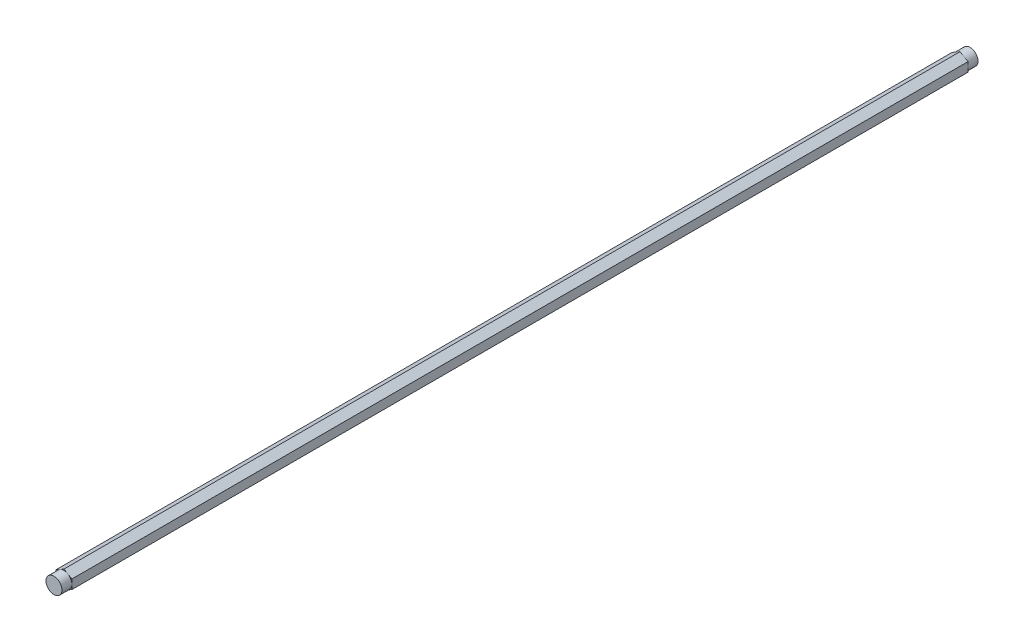
ISO-10303-21;
HEADER;
FILE_DESCRIPTION(('STEP AP214'),'2;1');
FILE_NAME('part.step','',(''),(''),'','','');
FILE_SCHEMA(('AUTOMOTIVE_DESIGN { 1 0 10303 214 1 1 1 1 }'));
ENDSEC;
DATA;
#1=APPLICATION_CONTEXT('core data for automotive mechanical design processes');
#2=APPLICATION_PROTOCOL_DEFINITION('international standard','automotive_design',2000,#1);
#3=PRODUCT_CONTEXT('',#1,'mechanical');
#4=PRODUCT('Part','Part','',(#3));
#5=PRODUCT_RELATED_PRODUCT_CATEGORY('part','',(#4));
#6=PRODUCT_DEFINITION_FORMATION('','',#4);
#7=PRODUCT_DEFINITION_CONTEXT('part definition',#1,'design');
#8=PRODUCT_DEFINITION('design','',#6,#7);
#9=PRODUCT_DEFINITION_SHAPE('','',#8);
#10=(LENGTH_UNIT() NAMED_UNIT(*) SI_UNIT(.MILLI.,.METRE.));
#11=(NAMED_UNIT(*) PLANE_ANGLE_UNIT() SI_UNIT($,.RADIAN.));
#12=(NAMED_UNIT(*) SI_UNIT($,.STERADIAN.) SOLID_ANGLE_UNIT());
#13=UNCERTAINTY_MEASURE_WITH_UNIT(LENGTH_MEASURE(1.E-05),#10,'distance_accuracy_value','');
#14=(GEOMETRIC_REPRESENTATION_CONTEXT(3) GLOBAL_UNCERTAINTY_ASSIGNED_CONTEXT((#13)) GLOBAL_UNIT_ASSIGNED_CONTEXT((#10,
#11,#12)) REPRESENTATION_CONTEXT('',''));
#15=CARTESIAN_POINT('',(0.,0.,0.));
#16=DIRECTION('',(0.,0.,1.));
#17=DIRECTION('',(1.,0.,0.));
#18=AXIS2_PLACEMENT_3D('',#15,#16,#17);
#19=CARTESIAN_POINT('',(6.35,-3.66617420935412,365.0361));
#20=DIRECTION('',(-1.,0.,0.));
#21=DIRECTION('',(0.,-1.,0.));
#22=AXIS2_PLACEMENT_3D('',#19,#20,#21);
#23=PLANE('',#22);
#24=DIRECTION('',(0.,-1.,0.));
#25=VECTOR('',#24,1.);
#26=CARTESIAN_POINT('',(6.35,-3.66617420935412,-357.0859));
#27=LINE('',#26,#25);
#28=CARTESIAN_POINT('',(6.35,3.66617420935413,-357.0859));
#29=VERTEX_POINT('',#28);
#30=CARTESIAN_POINT('',(6.35,0.,-357.0859));
#31=VERTEX_POINT('',#30);
#32=EDGE_CURVE('E138',#29,#31,#27,.T.);
#33=ORIENTED_EDGE('',*,*,#32,.F.);
#34=DIRECTION('',(0.,0.,-1.));
#35=VECTOR('',#34,1.);
#36=CARTESIAN_POINT('',(6.35,3.66617420935412,365.0361));
#37=LINE('',#36,#35);
#38=CARTESIAN_POINT('',(6.35,3.66617420935412,357.0859));
#39=VERTEX_POINT('',#38);
#40=EDGE_CURVE('E232',#39,#29,#37,.T.);
#41=ORIENTED_EDGE('',*,*,#40,.F.);
#42=DIRECTION('',(0.,1.,0.));
#43=VECTOR('',#42,1.);
#44=CARTESIAN_POINT('',(6.35,-3.66617420935412,357.0859));
#45=LINE('',#44,#43);
#46=CARTESIAN_POINT('',(6.35,0.,357.0859));
#47=VERTEX_POINT('',#46);
#48=EDGE_CURVE('E210',#47,#39,#45,.T.);
#49=ORIENTED_EDGE('',*,*,#48,.F.);
#50=CARTESIAN_POINT('',(6.35,-3.66617420935412,357.0859));
#51=VERTEX_POINT('',#50);
#52=EDGE_CURVE('E213',#51,#47,#45,.T.);
#53=ORIENTED_EDGE('',*,*,#52,.F.);
#54=DIRECTION('',(0.,0.,-1.));
#55=VECTOR('',#54,1.);
#56=CARTESIAN_POINT('',(6.35,-3.66617420935412,365.0361));
#57=LINE('',#56,#55);
#58=CARTESIAN_POINT('',(6.35,-3.66617420935412,-357.0859));
#59=VERTEX_POINT('',#58);
#60=EDGE_CURVE('E172',#51,#59,#57,.T.);
#61=ORIENTED_EDGE('',*,*,#60,.T.);
#62=EDGE_CURVE('E151',#31,#59,#27,.T.);
#63=ORIENTED_EDGE('',*,*,#62,.F.);
#64=EDGE_LOOP('',(#33,#41,#49,#53,#61,#63));
#65=FACE_BOUND('',#64,.T.);
#66=ADVANCED_FACE('F47',(#65),#23,.F.);
#67=CARTESIAN_POINT('',(6.35,3.66617420935412,365.0361));
#68=DIRECTION('',(-0.5,-0.866025403784439,0.));
#69=DIRECTION('',(0.866025403784439,-0.5,0.));
#70=AXIS2_PLACEMENT_3D('',#67,#68,#69);
#71=PLANE('',#70);
#72=DIRECTION('',(0.866025403784439,-0.5,0.));
#73=VECTOR('',#72,1.);
#74=CARTESIAN_POINT('',(6.35,3.66617420935412,-357.0859));
#75=LINE('',#74,#73);
#76=CARTESIAN_POINT('',(0.,7.33234841870825,-357.0859));
#77=VERTEX_POINT('',#76);
#78=CARTESIAN_POINT('',(3.175,5.49926131403119,-357.0859));
#79=VERTEX_POINT('',#78);
#80=EDGE_CURVE('E183',#77,#79,#75,.T.);
#81=ORIENTED_EDGE('',*,*,#80,.F.);
#82=DIRECTION('',(0.,0.,-1.));
#83=VECTOR('',#82,1.);
#84=CARTESIAN_POINT('',(0.,7.33234841870825,365.0361));
#85=LINE('',#84,#83);
#86=CARTESIAN_POINT('',(0.,7.33234841870825,357.0859));
#87=VERTEX_POINT('',#86);
#88=EDGE_CURVE('E228',#87,#77,#85,.T.);
#89=ORIENTED_EDGE('',*,*,#88,.F.);
#90=DIRECTION('',(-0.866025403784439,0.5,0.));
#91=VECTOR('',#90,1.);
#92=CARTESIAN_POINT('',(6.35,3.66617420935412,357.0859));
#93=LINE('',#92,#91);
#94=CARTESIAN_POINT('',(3.175,5.49926131403119,357.0859));
#95=VERTEX_POINT('',#94);
#96=EDGE_CURVE('E206',#95,#87,#93,.T.);
#97=ORIENTED_EDGE('',*,*,#96,.F.);
#98=EDGE_CURVE('E209',#39,#95,#93,.T.);
#99=ORIENTED_EDGE('',*,*,#98,.F.);
#100=ORIENTED_EDGE('',*,*,#40,.T.);
#101=EDGE_CURVE('E144',#79,#29,#75,.T.);
#102=ORIENTED_EDGE('',*,*,#101,.F.);
#103=EDGE_LOOP('',(#81,#89,#97,#99,#100,#102));
#104=FACE_BOUND('',#103,.T.);
#105=ADVANCED_FACE('F321',(#104),#71,.F.);
#106=CARTESIAN_POINT('',(0.,7.33234841870825,365.0361));
#107=DIRECTION('',(0.5,-0.866025403784439,0.));
#108=DIRECTION('',(0.866025403784439,0.5,0.));
#109=AXIS2_PLACEMENT_3D('',#106,#107,#108);
#110=PLANE('',#109);
#111=DIRECTION('',(0.866025403784439,0.5,0.));
#112=VECTOR('',#111,1.);
#113=CARTESIAN_POINT('',(0.,7.33234841870825,-357.0859));
#114=LINE('',#113,#112);
#115=CARTESIAN_POINT('',(-6.35,3.66617420935412,-357.0859));
#116=VERTEX_POINT('',#115);
#117=CARTESIAN_POINT('',(-3.175,5.49926131403119,-357.0859));
#118=VERTEX_POINT('',#117);
#119=EDGE_CURVE('E187',#116,#118,#114,.T.);
#120=ORIENTED_EDGE('',*,*,#119,.F.);
#121=DIRECTION('',(0.,0.,-1.));
#122=VECTOR('',#121,1.);
#123=CARTESIAN_POINT('',(-6.35,3.66617420935412,365.0361));
#124=LINE('',#123,#122);
#125=CARTESIAN_POINT('',(-6.35,3.66617420935412,357.0859));
#126=VERTEX_POINT('',#125);
#127=EDGE_CURVE('E224',#126,#116,#124,.T.);
#128=ORIENTED_EDGE('',*,*,#127,.F.);
#129=DIRECTION('',(-0.866025403784439,-0.5,0.));
#130=VECTOR('',#129,1.);
#131=CARTESIAN_POINT('',(0.,7.33234841870825,357.0859));
#132=LINE('',#131,#130);
#133=CARTESIAN_POINT('',(-3.175,5.49926131403119,357.0859));
#134=VERTEX_POINT('',#133);
#135=EDGE_CURVE('E202',#134,#126,#132,.T.);
#136=ORIENTED_EDGE('',*,*,#135,.F.);
#137=EDGE_CURVE('E205',#87,#134,#132,.T.);
#138=ORIENTED_EDGE('',*,*,#137,.F.);
#139=ORIENTED_EDGE('',*,*,#88,.T.);
#140=EDGE_CURVE('E184',#118,#77,#114,.T.);
#141=ORIENTED_EDGE('',*,*,#140,.F.);
#142=EDGE_LOOP('',(#120,#128,#136,#138,#139,#141));
#143=FACE_BOUND('',#142,.T.);
#144=ADVANCED_FACE('F305',(#143),#110,.F.);
#145=CARTESIAN_POINT('',(-6.35,3.66617420935412,365.0361));
#146=DIRECTION('',(1.,0.,0.));
#147=DIRECTION('',(0.,1.,0.));
#148=AXIS2_PLACEMENT_3D('',#145,#146,#147);
#149=PLANE('',#148);
#150=DIRECTION('',(0.,1.,0.));
#151=VECTOR('',#150,1.);
#152=CARTESIAN_POINT('',(-6.35,3.66617420935412,-357.0859));
#153=LINE('',#152,#151);
#154=CARTESIAN_POINT('',(-6.35,-3.66617420935412,-357.0859));
#155=VERTEX_POINT('',#154);
#156=CARTESIAN_POINT('',(-6.35,0.,-357.0859));
#157=VERTEX_POINT('',#156);
#158=EDGE_CURVE('E177',#155,#157,#153,.T.);
#159=ORIENTED_EDGE('',*,*,#158,.F.);
#160=DIRECTION('',(0.,0.,-1.));
#161=VECTOR('',#160,1.);
#162=CARTESIAN_POINT('',(-6.35,-3.66617420935412,365.0361));
#163=LINE('',#162,#161);
#164=CARTESIAN_POINT('',(-6.35,-3.66617420935412,357.0859));
#165=VERTEX_POINT('',#164);
#166=EDGE_CURVE('E220',#165,#155,#163,.T.);
#167=ORIENTED_EDGE('',*,*,#166,.F.);
#168=DIRECTION('',(0.,-1.,0.));
#169=VECTOR('',#168,1.);
#170=CARTESIAN_POINT('',(-6.35,3.66617420935412,357.0859));
#171=LINE('',#170,#169);
#172=CARTESIAN_POINT('',(-6.35,0.,357.0859));
#173=VERTEX_POINT('',#172);
#174=EDGE_CURVE('E198',#173,#165,#171,.T.);
#175=ORIENTED_EDGE('',*,*,#174,.F.);
#176=EDGE_CURVE('E201',#126,#173,#171,.T.);
#177=ORIENTED_EDGE('',*,*,#176,.F.);
#178=ORIENTED_EDGE('',*,*,#127,.T.);
#179=EDGE_CURVE('E180',#157,#116,#153,.T.);
#180=ORIENTED_EDGE('',*,*,#179,.F.);
#181=EDGE_LOOP('',(#159,#167,#175,#177,#178,#180));
#182=FACE_BOUND('',#181,.T.);
#183=ADVANCED_FACE('F291',(#182),#149,.F.);
#184=CARTESIAN_POINT('',(-6.35,-3.66617420935412,365.0361));
#185=DIRECTION('',(0.5,0.866025403784439,0.));
#186=DIRECTION('',(-0.866025403784439,0.5,0.));
#187=AXIS2_PLACEMENT_3D('',#184,#185,#186);
#188=PLANE('',#187);
#189=DIRECTION('',(-0.866025403784439,0.5,0.));
#190=VECTOR('',#189,1.);
#191=CARTESIAN_POINT('',(-6.35,-3.66617420935412,-357.0859));
#192=LINE('',#191,#190);
#193=CARTESIAN_POINT('',(0.,-7.33234841870825,-357.0859));
#194=VERTEX_POINT('',#193);
#195=CARTESIAN_POINT('',(-3.175,-5.49926131403119,-357.0859));
#196=VERTEX_POINT('',#195);
#197=EDGE_CURVE('E168',#194,#196,#192,.T.);
#198=ORIENTED_EDGE('',*,*,#197,.F.);
#199=DIRECTION('',(0.,0.,-1.));
#200=VECTOR('',#199,1.);
#201=CARTESIAN_POINT('',(0.,-7.33234841870825,365.0361));
#202=LINE('',#201,#200);
#203=CARTESIAN_POINT('',(0.,-7.33234841870825,357.0859));
#204=VERTEX_POINT('',#203);
#205=EDGE_CURVE('E216',#204,#194,#202,.T.);
#206=ORIENTED_EDGE('',*,*,#205,.F.);
#207=DIRECTION('',(0.866025403784439,-0.5,0.));
#208=VECTOR('',#207,1.);
#209=CARTESIAN_POINT('',(-6.35,-3.66617420935412,357.0859));
#210=LINE('',#209,#208);
#211=CARTESIAN_POINT('',(-3.175,-5.49926131403119,357.0859));
#212=VERTEX_POINT('',#211);
#213=EDGE_CURVE('E192',#212,#204,#210,.T.);
#214=ORIENTED_EDGE('',*,*,#213,.F.);
#215=EDGE_CURVE('E197',#165,#212,#210,.T.);
#216=ORIENTED_EDGE('',*,*,#215,.F.);
#217=ORIENTED_EDGE('',*,*,#166,.T.);
#218=EDGE_CURVE('E150',#196,#155,#192,.T.);
#219=ORIENTED_EDGE('',*,*,#218,.F.);
#220=EDGE_LOOP('',(#198,#206,#214,#216,#217,#219));
#221=FACE_BOUND('',#220,.T.);
#222=ADVANCED_FACE('F294',(#221),#188,.F.);
#223=CARTESIAN_POINT('',(0.,-7.33234841870825,365.0361));
#224=DIRECTION('',(-0.5,0.866025403784439,0.));
#225=DIRECTION('',(-0.866025403784439,-0.5,0.));
#226=AXIS2_PLACEMENT_3D('',#223,#224,#225);
#227=PLANE('',#226);
#228=DIRECTION('',(-0.866025403784439,-0.5,0.));
#229=VECTOR('',#228,1.);
#230=CARTESIAN_POINT('',(0.,-7.33234841870825,-357.0859));
#231=LINE('',#230,#229);
#232=CARTESIAN_POINT('',(3.175,-5.49926131403119,-357.0859));
#233=VERTEX_POINT('',#232);
#234=EDGE_CURVE('E12',#59,#233,#231,.T.);
#235=ORIENTED_EDGE('',*,*,#234,.F.);
#236=ORIENTED_EDGE('',*,*,#60,.F.);
#237=DIRECTION('',(0.866025403784439,0.5,0.));
#238=VECTOR('',#237,1.);
#239=CARTESIAN_POINT('',(0.,-7.33234841870825,357.0859));
#240=LINE('',#239,#238);
#241=CARTESIAN_POINT('',(3.175,-5.49926131403119,357.0859));
#242=VERTEX_POINT('',#241);
#243=EDGE_CURVE('E239',#242,#51,#240,.T.);
#244=ORIENTED_EDGE('',*,*,#243,.F.);
#245=EDGE_CURVE('E241',#204,#242,#240,.T.);
#246=ORIENTED_EDGE('',*,*,#245,.F.);
#247=ORIENTED_EDGE('',*,*,#205,.T.);
#248=EDGE_CURVE('E50',#233,#194,#231,.T.);
#249=ORIENTED_EDGE('',*,*,#248,.F.);
#250=EDGE_LOOP('',(#235,#236,#244,#246,#247,#249));
#251=FACE_BOUND('',#250,.T.);
#252=ADVANCED_FACE('F257',(#251),#227,.F.);
#253=CARTESIAN_POINT('',(0.,0.,357.0859));
#254=DIRECTION('',(0.,0.,1.));
#255=DIRECTION('',(1.,0.,0.));
#256=AXIS2_PLACEMENT_3D('',#253,#254,#255);
#257=PLANE('',#256);
#258=ORIENTED_EDGE('',*,*,#52,.T.);
#259=CARTESIAN_POINT('',(0.,0.,357.0859));
#260=DIRECTION('',(0.,0.,1.));
#261=DIRECTION('',(1.,0.,0.));
#262=AXIS2_PLACEMENT_3D('',#259,#260,#261);
#263=CIRCLE('',#262,6.35);
#264=EDGE_CURVE('E194',#242,#47,#263,.T.);
#265=ORIENTED_EDGE('',*,*,#264,.F.);
#266=ORIENTED_EDGE('',*,*,#243,.T.);
#267=EDGE_LOOP('',(#258,#265,#266));
#268=FACE_BOUND('',#267,.T.);
#269=ADVANCED_FACE('F259',(#268),#257,.T.);
#270=ORIENTED_EDGE('',*,*,#48,.T.);
#271=ORIENTED_EDGE('',*,*,#98,.T.);
#272=EDGE_CURVE('E188',#47,#95,#263,.T.);
#273=ORIENTED_EDGE('',*,*,#272,.F.);
#274=EDGE_LOOP('',(#270,#271,#273));
#275=FACE_BOUND('',#274,.T.);
#276=ADVANCED_FACE('F331',(#275),#257,.T.);
#277=ORIENTED_EDGE('',*,*,#96,.T.);
#278=ORIENTED_EDGE('',*,*,#137,.T.);
#279=EDGE_CURVE('E193',#95,#134,#263,.T.);
#280=ORIENTED_EDGE('',*,*,#279,.F.);
#281=EDGE_LOOP('',(#277,#278,#280));
#282=FACE_BOUND('',#281,.T.);
#283=ADVANCED_FACE('F325',(#282),#257,.T.);
#284=ORIENTED_EDGE('',*,*,#135,.T.);
#285=ORIENTED_EDGE('',*,*,#176,.T.);
#286=EDGE_CURVE('E269',#134,#173,#263,.T.);
#287=ORIENTED_EDGE('',*,*,#286,.F.);
#288=EDGE_LOOP('',(#284,#285,#287));
#289=FACE_BOUND('',#288,.T.);
#290=ADVANCED_FACE('F326',(#289),#257,.T.);
#291=ORIENTED_EDGE('',*,*,#174,.T.);
#292=ORIENTED_EDGE('',*,*,#215,.T.);
#293=EDGE_CURVE('E272',#173,#212,#263,.T.);
#294=ORIENTED_EDGE('',*,*,#293,.F.);
#295=EDGE_LOOP('',(#291,#292,#294));
#296=FACE_BOUND('',#295,.T.);
#297=ADVANCED_FACE('F297',(#296),#257,.T.);
#298=ORIENTED_EDGE('',*,*,#213,.T.);
#299=ORIENTED_EDGE('',*,*,#245,.T.);
#300=EDGE_CURVE('E70',#212,#242,#263,.T.);
#301=ORIENTED_EDGE('',*,*,#300,.F.);
#302=EDGE_LOOP('',(#298,#299,#301));
#303=FACE_BOUND('',#302,.T.);
#304=ADVANCED_FACE('F253',(#303),#257,.T.);
#305=CARTESIAN_POINT('',(0.,0.,357.0859));
#306=DIRECTION('',(0.,0.,1.));
#307=DIRECTION('',(1.,0.,0.));
#308=AXIS2_PLACEMENT_3D('',#305,#306,#307);
#309=CYLINDRICAL_SURFACE('',#308,6.35);
#310=CARTESIAN_POINT('',(0.,0.,365.0361));
#311=DIRECTION('',(0.,0.,1.));
#312=DIRECTION('',(1.,0.,0.));
#313=AXIS2_PLACEMENT_3D('',#310,#311,#312);
#314=CIRCLE('',#313,6.35);
#315=CARTESIAN_POINT('',(6.35,0.,365.0361));
#316=VERTEX_POINT('',#315);
#317=EDGE_CURVE('E235',#316,#316,#314,.T.);
#318=ORIENTED_EDGE('',*,*,#317,.F.);
#319=EDGE_LOOP('',(#318));
#320=FACE_BOUND('',#319,.T.);
#321=ORIENTED_EDGE('',*,*,#264,.T.);
#322=ORIENTED_EDGE('',*,*,#272,.T.);
#323=ORIENTED_EDGE('',*,*,#279,.T.);
#324=ORIENTED_EDGE('',*,*,#286,.T.);
#325=ORIENTED_EDGE('',*,*,#293,.T.);
#326=ORIENTED_EDGE('',*,*,#300,.T.);
#327=EDGE_LOOP('',(#321,#322,#323,#324,#325,#326));
#328=FACE_BOUND('',#327,.T.);
#329=ADVANCED_FACE('F327',(#320,#328),#309,.T.);
#330=CARTESIAN_POINT('',(0.,0.,365.0361));
#331=DIRECTION('',(0.,0.,1.));
#332=DIRECTION('',(1.,0.,0.));
#333=AXIS2_PLACEMENT_3D('',#330,#331,#332);
#334=PLANE('',#333);
#335=ORIENTED_EDGE('',*,*,#317,.T.);
#336=EDGE_LOOP('',(#335));
#337=FACE_BOUND('',#336,.T.);
#338=ADVANCED_FACE('F358',(#337),#334,.T.);
#339=CARTESIAN_POINT('',(0.,0.,-357.0859));
#340=DIRECTION('',(0.,0.,-1.));
#341=DIRECTION('',(-1.,0.,0.));
#342=AXIS2_PLACEMENT_3D('',#339,#340,#341);
#343=PLANE('',#342);
#344=ORIENTED_EDGE('',*,*,#119,.T.);
#345=CARTESIAN_POINT('',(0.,0.,-357.0859));
#346=DIRECTION('',(0.,0.,1.));
#347=DIRECTION('',(1.,0.,0.));
#348=AXIS2_PLACEMENT_3D('',#345,#346,#347);
#349=CIRCLE('',#348,6.35);
#350=EDGE_CURVE('E311',#118,#157,#349,.T.);
#351=ORIENTED_EDGE('',*,*,#350,.T.);
#352=ORIENTED_EDGE('',*,*,#179,.T.);
#353=EDGE_LOOP('',(#344,#351,#352));
#354=FACE_BOUND('',#353,.T.);
#355=ADVANCED_FACE('F310',(#354),#343,.T.);
#356=ORIENTED_EDGE('',*,*,#140,.T.);
#357=ORIENTED_EDGE('',*,*,#80,.T.);
#358=EDGE_CURVE('E166',#79,#118,#349,.T.);
#359=ORIENTED_EDGE('',*,*,#358,.T.);
#360=EDGE_LOOP('',(#356,#357,#359));
#361=FACE_BOUND('',#360,.T.);
#362=ADVANCED_FACE('F314',(#361),#343,.T.);
#363=ORIENTED_EDGE('',*,*,#101,.T.);
#364=ORIENTED_EDGE('',*,*,#32,.T.);
#365=EDGE_CURVE('E142',#31,#79,#349,.T.);
#366=ORIENTED_EDGE('',*,*,#365,.T.);
#367=EDGE_LOOP('',(#363,#364,#366));
#368=FACE_BOUND('',#367,.T.);
#369=ADVANCED_FACE('F140',(#368),#343,.T.);
#370=ORIENTED_EDGE('',*,*,#158,.T.);
#371=EDGE_CURVE('E285',#157,#196,#349,.T.);
#372=ORIENTED_EDGE('',*,*,#371,.T.);
#373=ORIENTED_EDGE('',*,*,#218,.T.);
#374=EDGE_LOOP('',(#370,#372,#373));
#375=FACE_BOUND('',#374,.T.);
#376=ADVANCED_FACE('F283',(#375),#343,.T.);
#377=ORIENTED_EDGE('',*,*,#62,.T.);
#378=ORIENTED_EDGE('',*,*,#234,.T.);
#379=EDGE_CURVE('E154',#233,#31,#349,.T.);
#380=ORIENTED_EDGE('',*,*,#379,.T.);
#381=EDGE_LOOP('',(#377,#378,#380));
#382=FACE_BOUND('',#381,.T.);
#383=ADVANCED_FACE('F155',(#382),#343,.T.);
#384=ORIENTED_EDGE('',*,*,#197,.T.);
#385=EDGE_CURVE('E62',#196,#233,#349,.T.);
#386=ORIENTED_EDGE('',*,*,#385,.T.);
#387=ORIENTED_EDGE('',*,*,#248,.T.);
#388=EDGE_LOOP('',(#384,#386,#387));
#389=FACE_BOUND('',#388,.T.);
#390=ADVANCED_FACE('F365',(#389),#343,.T.);
#391=CARTESIAN_POINT('',(0.,0.,-357.0859));
#392=DIRECTION('',(0.,0.,-1.));
#393=DIRECTION('',(-1.,0.,0.));
#394=AXIS2_PLACEMENT_3D('',#391,#392,#393);
#395=CYLINDRICAL_SURFACE('',#394,6.35);
#396=ORIENTED_EDGE('',*,*,#365,.F.);
#397=ORIENTED_EDGE('',*,*,#379,.F.);
#398=ORIENTED_EDGE('',*,*,#385,.F.);
#399=ORIENTED_EDGE('',*,*,#371,.F.);
#400=ORIENTED_EDGE('',*,*,#350,.F.);
#401=ORIENTED_EDGE('',*,*,#358,.F.);
#402=EDGE_LOOP('',(#396,#397,#398,#399,#400,#401));
#403=FACE_BOUND('',#402,.T.);
#404=CARTESIAN_POINT('',(0.,0.,-365.0361));
#405=DIRECTION('',(0.,0.,1.));
#406=DIRECTION('',(1.,0.,0.));
#407=AXIS2_PLACEMENT_3D('',#404,#405,#406);
#408=CIRCLE('',#407,6.35);
#409=CARTESIAN_POINT('',(6.35,0.,-365.0361));
#410=VERTEX_POINT('',#409);
#411=EDGE_CURVE('E242',#410,#410,#408,.F.);
#412=ORIENTED_EDGE('',*,*,#411,.F.);
#413=EDGE_LOOP('',(#412));
#414=FACE_BOUND('',#413,.T.);
#415=ADVANCED_FACE('F162',(#403,#414),#395,.T.);
#416=CARTESIAN_POINT('',(0.,0.,-365.0361));
#417=DIRECTION('',(0.,0.,1.));
#418=DIRECTION('',(1.,0.,0.));
#419=AXIS2_PLACEMENT_3D('',#416,#417,#418);
#420=PLANE('',#419);
#421=ORIENTED_EDGE('',*,*,#411,.T.);
#422=EDGE_LOOP('',(#421));
#423=FACE_BOUND('',#422,.T.);
#424=ADVANCED_FACE('F356',(#423),#420,.F.);
#425=CLOSED_SHELL('',(#66,#105,#144,#183,#222,#252,#269,#276,#283,#290,#297,#304,#329,#338,#355,
#362,#369,#376,#383,#390,#415,#424));
#426=MANIFOLD_SOLID_BREP('B2',#425);
#427=ADVANCED_BREP_SHAPE_REPRESENTATION('',(#18,#426),#14);
#428=SHAPE_DEFINITION_REPRESENTATION(#9,#427);
ENDSEC;
END-ISO-10303-21;
